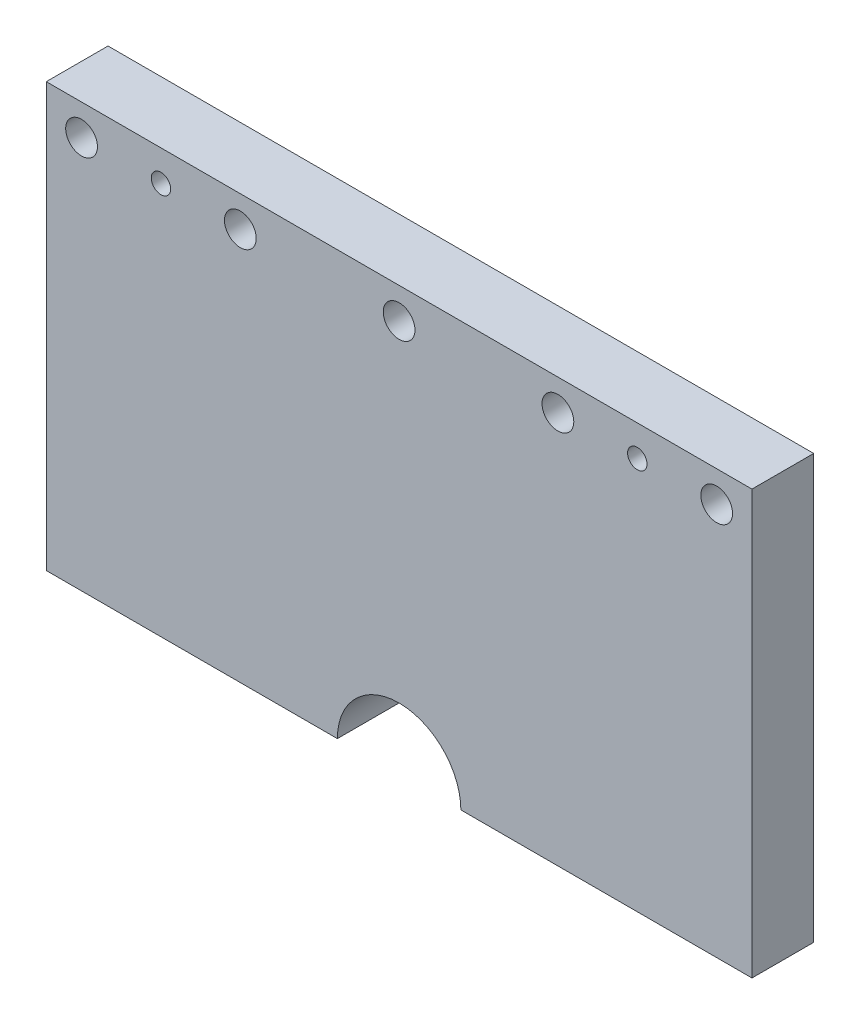
ISO-10303-21;
HEADER;
FILE_DESCRIPTION(('STEP AP214'),'2;1');
FILE_NAME('part.step','',(''),(''),'','','');
FILE_SCHEMA(('AUTOMOTIVE_DESIGN { 1 0 10303 214 1 1 1 1 }'));
ENDSEC;
DATA;
#1=APPLICATION_CONTEXT('core data for automotive mechanical design processes');
#2=APPLICATION_PROTOCOL_DEFINITION('international standard','automotive_design',2000,#1);
#3=PRODUCT_CONTEXT('',#1,'mechanical');
#4=PRODUCT('Part','Part','',(#3));
#5=PRODUCT_RELATED_PRODUCT_CATEGORY('part','',(#4));
#6=PRODUCT_DEFINITION_FORMATION('','',#4);
#7=PRODUCT_DEFINITION_CONTEXT('part definition',#1,'design');
#8=PRODUCT_DEFINITION('design','',#6,#7);
#9=PRODUCT_DEFINITION_SHAPE('','',#8);
#10=(LENGTH_UNIT() NAMED_UNIT(*) SI_UNIT(.MILLI.,.METRE.));
#11=(NAMED_UNIT(*) PLANE_ANGLE_UNIT() SI_UNIT($,.RADIAN.));
#12=(NAMED_UNIT(*) SI_UNIT($,.STERADIAN.) SOLID_ANGLE_UNIT());
#13=UNCERTAINTY_MEASURE_WITH_UNIT(LENGTH_MEASURE(1.E-05),#10,'distance_accuracy_value','');
#14=(GEOMETRIC_REPRESENTATION_CONTEXT(3) GLOBAL_UNCERTAINTY_ASSIGNED_CONTEXT((#13)) GLOBAL_UNIT_ASSIGNED_CONTEXT((#10,
#11,#12)) REPRESENTATION_CONTEXT('',''));
#15=CARTESIAN_POINT('',(0.,0.,0.));
#16=DIRECTION('',(0.,0.,1.));
#17=DIRECTION('',(1.,0.,0.));
#18=AXIS2_PLACEMENT_3D('',#15,#16,#17);
#19=CARTESIAN_POINT('',(200.,-240.,35.));
#20=DIRECTION('',(0.,1.,0.));
#21=DIRECTION('',(-1.,0.,0.));
#22=AXIS2_PLACEMENT_3D('',#19,#20,#21);
#23=PLANE('',#22);
#24=CARTESIAN_POINT('',(130.,-240.,17.5));
#25=DIRECTION('',(0.,-1.,0.));
#26=DIRECTION('',(0.,0.,-1.));
#27=AXIS2_PLACEMENT_3D('',#24,#25,#26);
#28=CIRCLE('',#27,5.);
#29=CARTESIAN_POINT('',(130.,-240.,12.5));
#30=VERTEX_POINT('',#29);
#31=EDGE_CURVE('E126',#30,#30,#28,.T.);
#32=ORIENTED_EDGE('',*,*,#31,.F.);
#33=EDGE_LOOP('',(#32));
#34=FACE_BOUND('',#33,.T.);
#35=CARTESIAN_POINT('',(180.,-240.,17.5));
#36=DIRECTION('',(0.,-1.,0.));
#37=DIRECTION('',(0.,0.,-1.));
#38=AXIS2_PLACEMENT_3D('',#35,#36,#37);
#39=CIRCLE('',#38,4.25);
#40=CARTESIAN_POINT('',(180.,-240.,13.25));
#41=VERTEX_POINT('',#40);
#42=EDGE_CURVE('E138',#41,#41,#39,.T.);
#43=ORIENTED_EDGE('',*,*,#42,.F.);
#44=EDGE_LOOP('',(#43));
#45=FACE_BOUND('',#44,.T.);
#46=CARTESIAN_POINT('',(80.0000000000002,-240.,17.5));
#47=DIRECTION('',(0.,-1.,0.));
#48=DIRECTION('',(0.,0.,-1.));
#49=AXIS2_PLACEMENT_3D('',#46,#47,#48);
#50=CIRCLE('',#49,4.25);
#51=CARTESIAN_POINT('',(80.0000000000002,-240.,13.25));
#52=VERTEX_POINT('',#51);
#53=EDGE_CURVE('E144',#52,#52,#50,.T.);
#54=ORIENTED_EDGE('',*,*,#53,.F.);
#55=EDGE_LOOP('',(#54));
#56=FACE_BOUND('',#55,.T.);
#57=DIRECTION('',(1.,0.,0.));
#58=VECTOR('',#57,1.);
#59=CARTESIAN_POINT('',(200.,-240.,35.));
#60=LINE('',#59,#58);
#61=CARTESIAN_POINT('',(35.0000000000001,-240.,35.));
#62=VERTEX_POINT('',#61);
#63=CARTESIAN_POINT('',(200.,-240.,35.));
#64=VERTEX_POINT('',#63);
#65=EDGE_CURVE('E60',#62,#64,#60,.T.);
#66=ORIENTED_EDGE('',*,*,#65,.F.);
#67=DIRECTION('',(0.,0.,-1.));
#68=VECTOR('',#67,1.);
#69=CARTESIAN_POINT('',(35.0000000000001,-240.,35.));
#70=LINE('',#69,#68);
#71=CARTESIAN_POINT('',(35.0000000000001,-240.,0.));
#72=VERTEX_POINT('',#71);
#73=EDGE_CURVE('E167',#62,#72,#70,.T.);
#74=ORIENTED_EDGE('',*,*,#73,.T.);
#75=DIRECTION('',(1.,0.,0.));
#76=VECTOR('',#75,1.);
#77=CARTESIAN_POINT('',(200.,-240.,0.));
#78=LINE('',#77,#76);
#79=CARTESIAN_POINT('',(200.,-240.,0.));
#80=VERTEX_POINT('',#79);
#81=EDGE_CURVE('E82',#72,#80,#78,.T.);
#82=ORIENTED_EDGE('',*,*,#81,.T.);
#83=DIRECTION('',(0.,0.,-1.));
#84=VECTOR('',#83,1.);
#85=CARTESIAN_POINT('',(200.,-240.,35.));
#86=LINE('',#85,#84);
#87=EDGE_CURVE('E179',#64,#80,#86,.T.);
#88=ORIENTED_EDGE('',*,*,#87,.F.);
#89=EDGE_LOOP('',(#66,#74,#82,#88));
#90=FACE_BOUND('',#89,.T.);
#91=ADVANCED_FACE('F34',(#34,#45,#56,#90),#23,.F.);
#92=CARTESIAN_POINT('',(200.,0.,35.));
#93=DIRECTION('',(-1.,0.,0.));
#94=DIRECTION('',(0.,-1.,0.));
#95=AXIS2_PLACEMENT_3D('',#92,#93,#94);
#96=PLANE('',#95);
#97=DIRECTION('',(0.,1.,0.));
#98=VECTOR('',#97,1.);
#99=CARTESIAN_POINT('',(200.,0.,0.));
#100=LINE('',#99,#98);
#101=CARTESIAN_POINT('',(200.,0.,0.));
#102=VERTEX_POINT('',#101);
#103=EDGE_CURVE('E169',#80,#102,#100,.T.);
#104=ORIENTED_EDGE('',*,*,#103,.T.);
#105=DIRECTION('',(0.,0.,-1.));
#106=VECTOR('',#105,1.);
#107=CARTESIAN_POINT('',(200.,0.,35.));
#108=LINE('',#107,#106);
#109=CARTESIAN_POINT('',(200.,0.,35.));
#110=VERTEX_POINT('',#109);
#111=EDGE_CURVE('E11',#110,#102,#108,.T.);
#112=ORIENTED_EDGE('',*,*,#111,.F.);
#113=DIRECTION('',(0.,1.,0.));
#114=VECTOR('',#113,1.);
#115=CARTESIAN_POINT('',(200.,0.,35.));
#116=LINE('',#115,#114);
#117=EDGE_CURVE('E170',#64,#110,#116,.T.);
#118=ORIENTED_EDGE('',*,*,#117,.F.);
#119=ORIENTED_EDGE('',*,*,#87,.T.);
#120=EDGE_LOOP('',(#104,#112,#118,#119));
#121=FACE_BOUND('',#120,.T.);
#122=ADVANCED_FACE('F36',(#121),#96,.F.);
#123=CARTESIAN_POINT('',(200.,0.,35.));
#124=DIRECTION('',(0.,-1.,0.));
#125=DIRECTION('',(1.,0.,0.));
#126=AXIS2_PLACEMENT_3D('',#123,#124,#125);
#127=PLANE('',#126);
#128=DIRECTION('',(-1.,0.,0.));
#129=VECTOR('',#128,1.);
#130=CARTESIAN_POINT('',(200.,0.,0.));
#131=LINE('',#130,#129);
#132=CARTESIAN_POINT('',(-200.,0.,0.));
#133=VERTEX_POINT('',#132);
#134=EDGE_CURVE('E182',#102,#133,#131,.T.);
#135=ORIENTED_EDGE('',*,*,#134,.T.);
#136=DIRECTION('',(0.,0.,-1.));
#137=VECTOR('',#136,1.);
#138=CARTESIAN_POINT('',(-200.,0.,35.));
#139=LINE('',#138,#137);
#140=CARTESIAN_POINT('',(-200.,0.,35.));
#141=VERTEX_POINT('',#140);
#142=EDGE_CURVE('E43',#141,#133,#139,.T.);
#143=ORIENTED_EDGE('',*,*,#142,.F.);
#144=DIRECTION('',(-1.,0.,0.));
#145=VECTOR('',#144,1.);
#146=CARTESIAN_POINT('',(200.,0.,35.));
#147=LINE('',#146,#145);
#148=EDGE_CURVE('E89',#110,#141,#147,.T.);
#149=ORIENTED_EDGE('',*,*,#148,.F.);
#150=ORIENTED_EDGE('',*,*,#111,.T.);
#151=EDGE_LOOP('',(#135,#143,#149,#150));
#152=FACE_BOUND('',#151,.T.);
#153=ADVANCED_FACE('F310',(#152),#127,.F.);
#154=CARTESIAN_POINT('',(-200.,0.,35.));
#155=DIRECTION('',(1.,0.,0.));
#156=DIRECTION('',(0.,1.,0.));
#157=AXIS2_PLACEMENT_3D('',#154,#155,#156);
#158=PLANE('',#157);
#159=DIRECTION('',(0.,-1.,0.));
#160=VECTOR('',#159,1.);
#161=CARTESIAN_POINT('',(-200.,0.,0.));
#162=LINE('',#161,#160);
#163=CARTESIAN_POINT('',(-200.,-240.,0.));
#164=VERTEX_POINT('',#163);
#165=EDGE_CURVE('E184',#133,#164,#162,.T.);
#166=ORIENTED_EDGE('',*,*,#165,.T.);
#167=DIRECTION('',(0.,0.,-1.));
#168=VECTOR('',#167,1.);
#169=CARTESIAN_POINT('',(-200.,-240.,35.));
#170=LINE('',#169,#168);
#171=CARTESIAN_POINT('',(-200.,-240.,35.));
#172=VERTEX_POINT('',#171);
#173=EDGE_CURVE('E189',#172,#164,#170,.T.);
#174=ORIENTED_EDGE('',*,*,#173,.F.);
#175=DIRECTION('',(0.,-1.,0.));
#176=VECTOR('',#175,1.);
#177=CARTESIAN_POINT('',(-200.,0.,35.));
#178=LINE('',#177,#176);
#179=EDGE_CURVE('E174',#141,#172,#178,.T.);
#180=ORIENTED_EDGE('',*,*,#179,.F.);
#181=ORIENTED_EDGE('',*,*,#142,.T.);
#182=EDGE_LOOP('',(#166,#174,#180,#181));
#183=FACE_BOUND('',#182,.T.);
#184=ADVANCED_FACE('F312',(#183),#158,.F.);
#185=CARTESIAN_POINT('',(-130.,-240.,17.5));
#186=DIRECTION('',(0.,-1.,0.));
#187=DIRECTION('',(0.,0.,-1.));
#188=AXIS2_PLACEMENT_3D('',#185,#186,#187);
#189=CIRCLE('',#188,5.);
#190=CARTESIAN_POINT('',(-130.,-240.,12.5));
#191=VERTEX_POINT('',#190);
#192=EDGE_CURVE('E125',#191,#191,#189,.T.);
#193=ORIENTED_EDGE('',*,*,#192,.F.);
#194=EDGE_LOOP('',(#193));
#195=FACE_BOUND('',#194,.T.);
#196=CARTESIAN_POINT('',(-79.9999999999998,-240.,17.5));
#197=DIRECTION('',(0.,-1.,0.));
#198=DIRECTION('',(0.,0.,-1.));
#199=AXIS2_PLACEMENT_3D('',#196,#197,#198);
#200=CIRCLE('',#199,4.25);
#201=CARTESIAN_POINT('',(-79.9999999999998,-240.,13.25));
#202=VERTEX_POINT('',#201);
#203=EDGE_CURVE('E150',#202,#202,#200,.T.);
#204=ORIENTED_EDGE('',*,*,#203,.F.);
#205=EDGE_LOOP('',(#204));
#206=FACE_BOUND('',#205,.T.);
#207=CARTESIAN_POINT('',(-180.,-240.,17.5));
#208=DIRECTION('',(0.,-1.,0.));
#209=DIRECTION('',(0.,0.,-1.));
#210=AXIS2_PLACEMENT_3D('',#207,#208,#209);
#211=CIRCLE('',#210,4.25);
#212=CARTESIAN_POINT('',(-180.,-240.,13.25));
#213=VERTEX_POINT('',#212);
#214=EDGE_CURVE('E156',#213,#213,#211,.T.);
#215=ORIENTED_EDGE('',*,*,#214,.F.);
#216=EDGE_LOOP('',(#215));
#217=FACE_BOUND('',#216,.T.);
#218=CARTESIAN_POINT('',(-35.,-240.,0.));
#219=VERTEX_POINT('',#218);
#220=EDGE_CURVE('E172',#164,#219,#78,.T.);
#221=ORIENTED_EDGE('',*,*,#220,.T.);
#222=DIRECTION('',(0.,0.,-1.));
#223=VECTOR('',#222,1.);
#224=CARTESIAN_POINT('',(-35.,-240.,35.));
#225=LINE('',#224,#223);
#226=CARTESIAN_POINT('',(-35.,-240.,35.));
#227=VERTEX_POINT('',#226);
#228=EDGE_CURVE('E51',#219,#227,#225,.F.);
#229=ORIENTED_EDGE('',*,*,#228,.T.);
#230=EDGE_CURVE('E176',#172,#227,#60,.T.);
#231=ORIENTED_EDGE('',*,*,#230,.F.);
#232=ORIENTED_EDGE('',*,*,#173,.T.);
#233=EDGE_LOOP('',(#221,#229,#231,#232));
#234=FACE_BOUND('',#233,.T.);
#235=ADVANCED_FACE('F296',(#195,#206,#217,#234),#23,.F.);
#236=CARTESIAN_POINT('',(0.,0.,35.));
#237=DIRECTION('',(0.,0.,-1.));
#238=DIRECTION('',(-1.,0.,0.));
#239=AXIS2_PLACEMENT_3D('',#236,#237,#238);
#240=PLANE('',#239);
#241=CARTESIAN_POINT('',(135.,-17.5,35.));
#242=DIRECTION('',(0.,0.,1.));
#243=DIRECTION('',(1.,0.,0.));
#244=AXIS2_PLACEMENT_3D('',#241,#242,#243);
#245=CIRCLE('',#244,5.49999999999998);
#246=CARTESIAN_POINT('',(140.5,-17.5,35.));
#247=VERTEX_POINT('',#246);
#248=EDGE_CURVE('E452',#247,#247,#245,.T.);
#249=ORIENTED_EDGE('',*,*,#248,.F.);
#250=EDGE_LOOP('',(#249));
#251=FACE_BOUND('',#250,.T.);
#252=CARTESIAN_POINT('',(-135.,-17.5,35.));
#253=DIRECTION('',(0.,0.,1.));
#254=DIRECTION('',(1.,0.,0.));
#255=AXIS2_PLACEMENT_3D('',#252,#253,#254);
#256=CIRCLE('',#255,5.49999999999998);
#257=CARTESIAN_POINT('',(-129.5,-17.5,35.));
#258=VERTEX_POINT('',#257);
#259=EDGE_CURVE('E203',#258,#258,#256,.T.);
#260=ORIENTED_EDGE('',*,*,#259,.F.);
#261=EDGE_LOOP('',(#260));
#262=FACE_BOUND('',#261,.T.);
#263=CARTESIAN_POINT('',(180.,-17.5,35.));
#264=DIRECTION('',(0.,0.,1.));
#265=DIRECTION('',(1.,0.,0.));
#266=AXIS2_PLACEMENT_3D('',#263,#264,#265);
#267=CIRCLE('',#266,9.00000000000001);
#268=CARTESIAN_POINT('',(189.,-17.5,35.));
#269=VERTEX_POINT('',#268);
#270=EDGE_CURVE('E213',#269,#269,#267,.T.);
#271=ORIENTED_EDGE('',*,*,#270,.F.);
#272=EDGE_LOOP('',(#271));
#273=FACE_BOUND('',#272,.T.);
#274=CARTESIAN_POINT('',(90.0000000000001,-17.5,35.));
#275=DIRECTION('',(0.,0.,1.));
#276=DIRECTION('',(1.,0.,0.));
#277=AXIS2_PLACEMENT_3D('',#274,#275,#276);
#278=CIRCLE('',#277,8.99999999999999);
#279=CARTESIAN_POINT('',(99.0000000000001,-17.5,35.));
#280=VERTEX_POINT('',#279);
#281=EDGE_CURVE('E225',#280,#280,#278,.T.);
#282=ORIENTED_EDGE('',*,*,#281,.F.);
#283=EDGE_LOOP('',(#282));
#284=FACE_BOUND('',#283,.T.);
#285=CARTESIAN_POINT('',(0.,-17.5,35.));
#286=DIRECTION('',(0.,0.,1.));
#287=DIRECTION('',(1.,0.,0.));
#288=AXIS2_PLACEMENT_3D('',#285,#286,#287);
#289=CIRCLE('',#288,9.);
#290=CARTESIAN_POINT('',(9.00000000000002,-17.5,35.));
#291=VERTEX_POINT('',#290);
#292=EDGE_CURVE('E237',#291,#291,#289,.T.);
#293=ORIENTED_EDGE('',*,*,#292,.F.);
#294=EDGE_LOOP('',(#293));
#295=FACE_BOUND('',#294,.T.);
#296=CARTESIAN_POINT('',(-90.,-17.5,35.));
#297=DIRECTION('',(0.,0.,1.));
#298=DIRECTION('',(1.,0.,0.));
#299=AXIS2_PLACEMENT_3D('',#296,#297,#298);
#300=CIRCLE('',#299,8.99999999999999);
#301=CARTESIAN_POINT('',(-81.,-17.5,35.));
#302=VERTEX_POINT('',#301);
#303=EDGE_CURVE('E249',#302,#302,#300,.T.);
#304=ORIENTED_EDGE('',*,*,#303,.F.);
#305=EDGE_LOOP('',(#304));
#306=FACE_BOUND('',#305,.T.);
#307=CARTESIAN_POINT('',(-180.,-17.5,35.));
#308=DIRECTION('',(0.,0.,1.));
#309=DIRECTION('',(1.,0.,0.));
#310=AXIS2_PLACEMENT_3D('',#307,#308,#309);
#311=CIRCLE('',#310,9.00000000000001);
#312=CARTESIAN_POINT('',(-171.,-17.5,35.));
#313=VERTEX_POINT('',#312);
#314=EDGE_CURVE('E261',#313,#313,#311,.T.);
#315=ORIENTED_EDGE('',*,*,#314,.F.);
#316=EDGE_LOOP('',(#315));
#317=FACE_BOUND('',#316,.T.);
#318=ORIENTED_EDGE('',*,*,#230,.T.);
#319=CARTESIAN_POINT('',(0.,-240.,35.));
#320=DIRECTION('',(0.,0.,-1.));
#321=DIRECTION('',(-1.,0.,0.));
#322=AXIS2_PLACEMENT_3D('',#319,#320,#321);
#323=CIRCLE('',#322,35.);
#324=EDGE_CURVE('E163',#227,#62,#323,.T.);
#325=ORIENTED_EDGE('',*,*,#324,.T.);
#326=ORIENTED_EDGE('',*,*,#65,.T.);
#327=ORIENTED_EDGE('',*,*,#117,.T.);
#328=ORIENTED_EDGE('',*,*,#148,.T.);
#329=ORIENTED_EDGE('',*,*,#179,.T.);
#330=EDGE_LOOP('',(#318,#325,#326,#327,#328,#329));
#331=FACE_BOUND('',#330,.T.);
#332=ADVANCED_FACE('F294',(#251,#262,#273,#284,#295,#306,#317,#331),#240,.F.);
#333=CARTESIAN_POINT('',(0.,0.,0.));
#334=DIRECTION('',(0.,0.,-1.));
#335=DIRECTION('',(-1.,0.,0.));
#336=AXIS2_PLACEMENT_3D('',#333,#334,#335);
#337=PLANE('',#336);
#338=CARTESIAN_POINT('',(135.,-17.5,0.));
#339=DIRECTION('',(0.,0.,1.));
#340=DIRECTION('',(1.,0.,0.));
#341=AXIS2_PLACEMENT_3D('',#338,#339,#340);
#342=CIRCLE('',#341,5.);
#343=CARTESIAN_POINT('',(140.,-17.5,0.));
#344=VERTEX_POINT('',#343);
#345=EDGE_CURVE('E195',#344,#344,#342,.T.);
#346=ORIENTED_EDGE('',*,*,#345,.T.);
#347=EDGE_LOOP('',(#346));
#348=FACE_BOUND('',#347,.T.);
#349=CARTESIAN_POINT('',(-135.,-17.5,0.));
#350=DIRECTION('',(0.,0.,1.));
#351=DIRECTION('',(1.,0.,0.));
#352=AXIS2_PLACEMENT_3D('',#349,#350,#351);
#353=CIRCLE('',#352,5.);
#354=CARTESIAN_POINT('',(-130.,-17.5,0.));
#355=VERTEX_POINT('',#354);
#356=EDGE_CURVE('E200',#355,#355,#353,.T.);
#357=ORIENTED_EDGE('',*,*,#356,.T.);
#358=EDGE_LOOP('',(#357));
#359=FACE_BOUND('',#358,.T.);
#360=CARTESIAN_POINT('',(180.,-17.5,0.));
#361=DIRECTION('',(0.,0.,1.));
#362=DIRECTION('',(1.,0.,0.));
#363=AXIS2_PLACEMENT_3D('',#360,#361,#362);
#364=CIRCLE('',#363,5.49999999999998);
#365=CARTESIAN_POINT('',(185.5,-17.5,0.));
#366=VERTEX_POINT('',#365);
#367=EDGE_CURVE('E222',#366,#366,#364,.T.);
#368=ORIENTED_EDGE('',*,*,#367,.T.);
#369=EDGE_LOOP('',(#368));
#370=FACE_BOUND('',#369,.T.);
#371=CARTESIAN_POINT('',(90.0000000000001,-17.5,0.));
#372=DIRECTION('',(0.,0.,1.));
#373=DIRECTION('',(1.,0.,0.));
#374=AXIS2_PLACEMENT_3D('',#371,#372,#373);
#375=CIRCLE('',#374,5.49999999999999);
#376=CARTESIAN_POINT('',(95.5000000000001,-17.5,0.));
#377=VERTEX_POINT('',#376);
#378=EDGE_CURVE('E234',#377,#377,#375,.T.);
#379=ORIENTED_EDGE('',*,*,#378,.T.);
#380=EDGE_LOOP('',(#379));
#381=FACE_BOUND('',#380,.T.);
#382=CARTESIAN_POINT('',(0.,-17.5,0.));
#383=DIRECTION('',(0.,0.,1.));
#384=DIRECTION('',(1.,0.,0.));
#385=AXIS2_PLACEMENT_3D('',#382,#383,#384);
#386=CIRCLE('',#385,5.49999999999999);
#387=CARTESIAN_POINT('',(5.50000000000001,-17.5,0.));
#388=VERTEX_POINT('',#387);
#389=EDGE_CURVE('E246',#388,#388,#386,.T.);
#390=ORIENTED_EDGE('',*,*,#389,.T.);
#391=EDGE_LOOP('',(#390));
#392=FACE_BOUND('',#391,.T.);
#393=CARTESIAN_POINT('',(-90.,-17.5,0.));
#394=DIRECTION('',(0.,0.,1.));
#395=DIRECTION('',(1.,0.,0.));
#396=AXIS2_PLACEMENT_3D('',#393,#394,#395);
#397=CIRCLE('',#396,5.49999999999999);
#398=CARTESIAN_POINT('',(-84.5,-17.5,0.));
#399=VERTEX_POINT('',#398);
#400=EDGE_CURVE('E258',#399,#399,#397,.T.);
#401=ORIENTED_EDGE('',*,*,#400,.T.);
#402=EDGE_LOOP('',(#401));
#403=FACE_BOUND('',#402,.T.);
#404=CARTESIAN_POINT('',(-180.,-17.5,0.));
#405=DIRECTION('',(0.,0.,1.));
#406=DIRECTION('',(1.,0.,0.));
#407=AXIS2_PLACEMENT_3D('',#404,#405,#406);
#408=CIRCLE('',#407,5.49999999999998);
#409=CARTESIAN_POINT('',(-174.5,-17.5,0.));
#410=VERTEX_POINT('',#409);
#411=EDGE_CURVE('E132',#410,#410,#408,.T.);
#412=ORIENTED_EDGE('',*,*,#411,.T.);
#413=EDGE_LOOP('',(#412));
#414=FACE_BOUND('',#413,.T.);
#415=CARTESIAN_POINT('',(0.,-240.,0.));
#416=DIRECTION('',(0.,0.,-1.));
#417=DIRECTION('',(-1.,0.,0.));
#418=AXIS2_PLACEMENT_3D('',#415,#416,#417);
#419=CIRCLE('',#418,35.);
#420=EDGE_CURVE('E162',#219,#72,#419,.T.);
#421=ORIENTED_EDGE('',*,*,#420,.F.);
#422=ORIENTED_EDGE('',*,*,#220,.F.);
#423=ORIENTED_EDGE('',*,*,#165,.F.);
#424=ORIENTED_EDGE('',*,*,#134,.F.);
#425=ORIENTED_EDGE('',*,*,#103,.F.);
#426=ORIENTED_EDGE('',*,*,#81,.F.);
#427=EDGE_LOOP('',(#421,#422,#423,#424,#425,#426));
#428=FACE_BOUND('',#427,.T.);
#429=ADVANCED_FACE('F272',(#348,#359,#370,#381,#392,#403,#414,#428),#337,.T.);
#430=CARTESIAN_POINT('',(0.,-240.,35.));
#431=DIRECTION('',(0.,0.,-1.));
#432=DIRECTION('',(-1.,0.,0.));
#433=AXIS2_PLACEMENT_3D('',#430,#431,#432);
#434=CYLINDRICAL_SURFACE('',#433,35.);
#435=ORIENTED_EDGE('',*,*,#324,.F.);
#436=ORIENTED_EDGE('',*,*,#228,.F.);
#437=ORIENTED_EDGE('',*,*,#420,.T.);
#438=ORIENTED_EDGE('',*,*,#73,.F.);
#439=EDGE_LOOP('',(#435,#436,#437,#438));
#440=FACE_BOUND('',#439,.T.);
#441=ADVANCED_FACE('F306',(#440),#434,.F.);
#442=CARTESIAN_POINT('',(-180.,-212.5,17.5));
#443=DIRECTION('',(0.,-1.,0.));
#444=DIRECTION('',(0.,0.,-1.));
#445=AXIS2_PLACEMENT_3D('',#442,#443,#444);
#446=CONICAL_SURFACE('',#445,4.25,1.02974425867665);
#447=CARTESIAN_POINT('',(-180.,-209.946342369133,17.5));
#448=VERTEX_POINT('',#447);
#449=VERTEX_LOOP('',#448);
#450=FACE_BOUND('',#449,.T.);
#451=CARTESIAN_POINT('',(-180.,-212.5,17.5));
#452=DIRECTION('',(0.,-1.,0.));
#453=DIRECTION('',(0.,0.,-1.));
#454=AXIS2_PLACEMENT_3D('',#451,#452,#453);
#455=CIRCLE('',#454,4.25);
#456=CARTESIAN_POINT('',(-180.,-212.5,13.25));
#457=VERTEX_POINT('',#456);
#458=EDGE_CURVE('E159',#457,#457,#455,.T.);
#459=ORIENTED_EDGE('',*,*,#458,.T.);
#460=EDGE_LOOP('',(#459));
#461=FACE_BOUND('',#460,.T.);
#462=ADVANCED_FACE('F335',(#450,#461),#446,.F.);
#463=CARTESIAN_POINT('',(-180.,-240.,17.5));
#464=DIRECTION('',(0.,-1.,0.));
#465=DIRECTION('',(0.,0.,-1.));
#466=AXIS2_PLACEMENT_3D('',#463,#464,#465);
#467=CYLINDRICAL_SURFACE('',#466,4.25);
#468=ORIENTED_EDGE('',*,*,#458,.F.);
#469=EDGE_LOOP('',(#468));
#470=FACE_BOUND('',#469,.T.);
#471=ORIENTED_EDGE('',*,*,#214,.T.);
#472=EDGE_LOOP('',(#471));
#473=FACE_BOUND('',#472,.T.);
#474=ADVANCED_FACE('F338',(#470,#473),#467,.F.);
#475=CARTESIAN_POINT('',(-79.9999999999998,-212.5,17.5));
#476=DIRECTION('',(0.,-1.,0.));
#477=DIRECTION('',(0.,0.,-1.));
#478=AXIS2_PLACEMENT_3D('',#475,#476,#477);
#479=CONICAL_SURFACE('',#478,4.25,1.02974425867665);
#480=CARTESIAN_POINT('',(-79.9999999999998,-209.946342369133,17.5));
#481=VERTEX_POINT('',#480);
#482=VERTEX_LOOP('',#481);
#483=FACE_BOUND('',#482,.T.);
#484=CARTESIAN_POINT('',(-79.9999999999998,-212.5,17.5));
#485=DIRECTION('',(0.,-1.,0.));
#486=DIRECTION('',(0.,0.,-1.));
#487=AXIS2_PLACEMENT_3D('',#484,#485,#486);
#488=CIRCLE('',#487,4.25);
#489=CARTESIAN_POINT('',(-79.9999999999998,-212.5,13.25));
#490=VERTEX_POINT('',#489);
#491=EDGE_CURVE('E153',#490,#490,#488,.T.);
#492=ORIENTED_EDGE('',*,*,#491,.T.);
#493=EDGE_LOOP('',(#492));
#494=FACE_BOUND('',#493,.T.);
#495=ADVANCED_FACE('F342',(#483,#494),#479,.F.);
#496=CARTESIAN_POINT('',(-79.9999999999998,-240.,17.5));
#497=DIRECTION('',(0.,-1.,0.));
#498=DIRECTION('',(0.,0.,-1.));
#499=AXIS2_PLACEMENT_3D('',#496,#497,#498);
#500=CYLINDRICAL_SURFACE('',#499,4.25);
#501=ORIENTED_EDGE('',*,*,#491,.F.);
#502=EDGE_LOOP('',(#501));
#503=FACE_BOUND('',#502,.T.);
#504=ORIENTED_EDGE('',*,*,#203,.T.);
#505=EDGE_LOOP('',(#504));
#506=FACE_BOUND('',#505,.T.);
#507=ADVANCED_FACE('F346',(#503,#506),#500,.F.);
#508=CARTESIAN_POINT('',(80.0000000000002,-212.5,17.5));
#509=DIRECTION('',(0.,-1.,0.));
#510=DIRECTION('',(0.,0.,-1.));
#511=AXIS2_PLACEMENT_3D('',#508,#509,#510);
#512=CONICAL_SURFACE('',#511,4.25,1.02974425867665);
#513=CARTESIAN_POINT('',(80.0000000000002,-209.946342369133,17.5));
#514=VERTEX_POINT('',#513);
#515=VERTEX_LOOP('',#514);
#516=FACE_BOUND('',#515,.T.);
#517=CARTESIAN_POINT('',(80.0000000000002,-212.5,17.5));
#518=DIRECTION('',(0.,-1.,0.));
#519=DIRECTION('',(0.,0.,-1.));
#520=AXIS2_PLACEMENT_3D('',#517,#518,#519);
#521=CIRCLE('',#520,4.25);
#522=CARTESIAN_POINT('',(80.0000000000002,-212.5,13.25));
#523=VERTEX_POINT('',#522);
#524=EDGE_CURVE('E147',#523,#523,#521,.T.);
#525=ORIENTED_EDGE('',*,*,#524,.T.);
#526=EDGE_LOOP('',(#525));
#527=FACE_BOUND('',#526,.T.);
#528=ADVANCED_FACE('F350',(#516,#527),#512,.F.);
#529=CARTESIAN_POINT('',(80.0000000000002,-240.,17.5));
#530=DIRECTION('',(0.,-1.,0.));
#531=DIRECTION('',(0.,0.,-1.));
#532=AXIS2_PLACEMENT_3D('',#529,#530,#531);
#533=CYLINDRICAL_SURFACE('',#532,4.25);
#534=ORIENTED_EDGE('',*,*,#524,.F.);
#535=EDGE_LOOP('',(#534));
#536=FACE_BOUND('',#535,.T.);
#537=ORIENTED_EDGE('',*,*,#53,.T.);
#538=EDGE_LOOP('',(#537));
#539=FACE_BOUND('',#538,.T.);
#540=ADVANCED_FACE('F354',(#536,#539),#533,.F.);
#541=CARTESIAN_POINT('',(180.,-212.5,17.5));
#542=DIRECTION('',(0.,-1.,0.));
#543=DIRECTION('',(0.,0.,-1.));
#544=AXIS2_PLACEMENT_3D('',#541,#542,#543);
#545=CONICAL_SURFACE('',#544,4.25,1.02974425867665);
#546=CARTESIAN_POINT('',(180.,-209.946342369133,17.5));
#547=VERTEX_POINT('',#546);
#548=VERTEX_LOOP('',#547);
#549=FACE_BOUND('',#548,.T.);
#550=CARTESIAN_POINT('',(180.,-212.5,17.5));
#551=DIRECTION('',(0.,-1.,0.));
#552=DIRECTION('',(0.,0.,-1.));
#553=AXIS2_PLACEMENT_3D('',#550,#551,#552);
#554=CIRCLE('',#553,4.25);
#555=CARTESIAN_POINT('',(180.,-212.5,13.25));
#556=VERTEX_POINT('',#555);
#557=EDGE_CURVE('E141',#556,#556,#554,.T.);
#558=ORIENTED_EDGE('',*,*,#557,.T.);
#559=EDGE_LOOP('',(#558));
#560=FACE_BOUND('',#559,.T.);
#561=ADVANCED_FACE('F358',(#549,#560),#545,.F.);
#562=CARTESIAN_POINT('',(180.,-240.,17.5));
#563=DIRECTION('',(0.,-1.,0.));
#564=DIRECTION('',(0.,0.,-1.));
#565=AXIS2_PLACEMENT_3D('',#562,#563,#564);
#566=CYLINDRICAL_SURFACE('',#565,4.25);
#567=ORIENTED_EDGE('',*,*,#557,.F.);
#568=EDGE_LOOP('',(#567));
#569=FACE_BOUND('',#568,.T.);
#570=ORIENTED_EDGE('',*,*,#42,.T.);
#571=EDGE_LOOP('',(#570));
#572=FACE_BOUND('',#571,.T.);
#573=ADVANCED_FACE('F362',(#569,#572),#566,.F.);
#574=CARTESIAN_POINT('',(-130.,-212.5,17.5));
#575=DIRECTION('',(0.,-1.,0.));
#576=DIRECTION('',(0.,0.,-1.));
#577=AXIS2_PLACEMENT_3D('',#574,#575,#576);
#578=CONICAL_SURFACE('',#577,4.99999999999999,1.02974425867665);
#579=CARTESIAN_POINT('',(-130.,-209.495696904862,17.5));
#580=VERTEX_POINT('',#579);
#581=VERTEX_LOOP('',#580);
#582=FACE_BOUND('',#581,.T.);
#583=CARTESIAN_POINT('',(-130.,-212.5,17.5));
#584=DIRECTION('',(0.,-1.,0.));
#585=DIRECTION('',(0.,0.,-1.));
#586=AXIS2_PLACEMENT_3D('',#583,#584,#585);
#587=CIRCLE('',#586,4.99999999999999);
#588=CARTESIAN_POINT('',(-130.,-212.5,12.5));
#589=VERTEX_POINT('',#588);
#590=EDGE_CURVE('E129',#589,#589,#587,.T.);
#591=ORIENTED_EDGE('',*,*,#590,.T.);
#592=EDGE_LOOP('',(#591));
#593=FACE_BOUND('',#592,.T.);
#594=ADVANCED_FACE('F366',(#582,#593),#578,.F.);
#595=CARTESIAN_POINT('',(-130.,-240.,17.5));
#596=DIRECTION('',(0.,-1.,0.));
#597=DIRECTION('',(0.,0.,-1.));
#598=AXIS2_PLACEMENT_3D('',#595,#596,#597);
#599=CYLINDRICAL_SURFACE('',#598,5.);
#600=ORIENTED_EDGE('',*,*,#590,.F.);
#601=EDGE_LOOP('',(#600));
#602=FACE_BOUND('',#601,.T.);
#603=ORIENTED_EDGE('',*,*,#192,.T.);
#604=EDGE_LOOP('',(#603));
#605=FACE_BOUND('',#604,.T.);
#606=ADVANCED_FACE('F119',(#602,#605),#599,.F.);
#607=CARTESIAN_POINT('',(130.,-212.5,17.5));
#608=DIRECTION('',(0.,-1.,0.));
#609=DIRECTION('',(0.,0.,-1.));
#610=AXIS2_PLACEMENT_3D('',#607,#608,#609);
#611=CONICAL_SURFACE('',#610,5.,1.02974425867666);
#612=CARTESIAN_POINT('',(130.,-209.495696904862,17.5));
#613=VERTEX_POINT('',#612);
#614=VERTEX_LOOP('',#613);
#615=FACE_BOUND('',#614,.T.);
#616=CARTESIAN_POINT('',(130.,-212.5,17.5));
#617=DIRECTION('',(0.,-1.,0.));
#618=DIRECTION('',(0.,0.,-1.));
#619=AXIS2_PLACEMENT_3D('',#616,#617,#618);
#620=CIRCLE('',#619,5.);
#621=CARTESIAN_POINT('',(130.,-212.5,12.5));
#622=VERTEX_POINT('',#621);
#623=EDGE_CURVE('E123',#622,#622,#620,.T.);
#624=ORIENTED_EDGE('',*,*,#623,.T.);
#625=EDGE_LOOP('',(#624));
#626=FACE_BOUND('',#625,.T.);
#627=ADVANCED_FACE('F115',(#615,#626),#611,.F.);
#628=CARTESIAN_POINT('',(130.,-240.,17.5));
#629=DIRECTION('',(0.,-1.,0.));
#630=DIRECTION('',(0.,0.,-1.));
#631=AXIS2_PLACEMENT_3D('',#628,#629,#630);
#632=CYLINDRICAL_SURFACE('',#631,5.);
#633=ORIENTED_EDGE('',*,*,#623,.F.);
#634=EDGE_LOOP('',(#633));
#635=FACE_BOUND('',#634,.T.);
#636=ORIENTED_EDGE('',*,*,#31,.T.);
#637=EDGE_LOOP('',(#636));
#638=FACE_BOUND('',#637,.T.);
#639=ADVANCED_FACE('F118',(#635,#638),#632,.F.);
#640=CARTESIAN_POINT('',(-180.,-17.5,35.));
#641=DIRECTION('',(0.,0.,1.));
#642=DIRECTION('',(1.,0.,0.));
#643=AXIS2_PLACEMENT_3D('',#640,#641,#642);
#644=CYLINDRICAL_SURFACE('',#643,5.49999999999999);
#645=ORIENTED_EDGE('',*,*,#411,.F.);
#646=EDGE_LOOP('',(#645));
#647=FACE_BOUND('',#646,.T.);
#648=CARTESIAN_POINT('',(-180.,-17.5,20.));
#649=DIRECTION('',(0.,0.,1.));
#650=DIRECTION('',(1.,0.,0.));
#651=AXIS2_PLACEMENT_3D('',#648,#649,#650);
#652=CIRCLE('',#651,5.50000000000001);
#653=CARTESIAN_POINT('',(-174.5,-17.5,20.));
#654=VERTEX_POINT('',#653);
#655=EDGE_CURVE('E267',#654,#654,#652,.T.);
#656=ORIENTED_EDGE('',*,*,#655,.T.);
#657=EDGE_LOOP('',(#656));
#658=FACE_BOUND('',#657,.T.);
#659=ADVANCED_FACE('F275',(#647,#658),#644,.F.);
#660=CARTESIAN_POINT('',(-174.5,-17.5,20.));
#661=DIRECTION('',(0.,0.,-1.));
#662=DIRECTION('',(-1.,0.,0.));
#663=AXIS2_PLACEMENT_3D('',#660,#661,#662);
#664=PLANE('',#663);
#665=ORIENTED_EDGE('',*,*,#655,.F.);
#666=EDGE_LOOP('',(#665));
#667=FACE_BOUND('',#666,.T.);
#668=CARTESIAN_POINT('',(-180.,-17.5,20.));
#669=DIRECTION('',(0.,0.,1.));
#670=DIRECTION('',(1.,0.,0.));
#671=AXIS2_PLACEMENT_3D('',#668,#669,#670);
#672=CIRCLE('',#671,9.00000000000001);
#673=CARTESIAN_POINT('',(-171.,-17.5,20.));
#674=VERTEX_POINT('',#673);
#675=EDGE_CURVE('E264',#674,#674,#672,.T.);
#676=ORIENTED_EDGE('',*,*,#675,.T.);
#677=EDGE_LOOP('',(#676));
#678=FACE_BOUND('',#677,.T.);
#679=ADVANCED_FACE('F278',(#667,#678),#664,.F.);
#680=CARTESIAN_POINT('',(-180.,-17.5,35.));
#681=DIRECTION('',(0.,0.,1.));
#682=DIRECTION('',(1.,0.,0.));
#683=AXIS2_PLACEMENT_3D('',#680,#681,#682);
#684=CYLINDRICAL_SURFACE('',#683,9.00000000000001);
#685=ORIENTED_EDGE('',*,*,#675,.F.);
#686=EDGE_LOOP('',(#685));
#687=FACE_BOUND('',#686,.T.);
#688=ORIENTED_EDGE('',*,*,#314,.T.);
#689=EDGE_LOOP('',(#688));
#690=FACE_BOUND('',#689,.T.);
#691=ADVANCED_FACE('F284',(#687,#690),#684,.F.);
#692=CARTESIAN_POINT('',(-90.,-17.5,35.));
#693=DIRECTION('',(0.,0.,1.));
#694=DIRECTION('',(1.,0.,0.));
#695=AXIS2_PLACEMENT_3D('',#692,#693,#694);
#696=CYLINDRICAL_SURFACE('',#695,5.5);
#697=ORIENTED_EDGE('',*,*,#400,.F.);
#698=EDGE_LOOP('',(#697));
#699=FACE_BOUND('',#698,.T.);
#700=CARTESIAN_POINT('',(-90.,-17.5,20.));
#701=DIRECTION('',(0.,0.,1.));
#702=DIRECTION('',(1.,0.,0.));
#703=AXIS2_PLACEMENT_3D('',#700,#701,#702);
#704=CIRCLE('',#703,5.50000000000001);
#705=CARTESIAN_POINT('',(-84.5,-17.5,20.));
#706=VERTEX_POINT('',#705);
#707=EDGE_CURVE('E255',#706,#706,#704,.T.);
#708=ORIENTED_EDGE('',*,*,#707,.T.);
#709=EDGE_LOOP('',(#708));
#710=FACE_BOUND('',#709,.T.);
#711=ADVANCED_FACE('F290',(#699,#710),#696,.F.);
#712=CARTESIAN_POINT('',(-84.5,-17.5,20.));
#713=DIRECTION('',(0.,0.,-1.));
#714=DIRECTION('',(-1.,0.,0.));
#715=AXIS2_PLACEMENT_3D('',#712,#713,#714);
#716=PLANE('',#715);
#717=ORIENTED_EDGE('',*,*,#707,.F.);
#718=EDGE_LOOP('',(#717));
#719=FACE_BOUND('',#718,.T.);
#720=CARTESIAN_POINT('',(-90.,-17.5,20.));
#721=DIRECTION('',(0.,0.,1.));
#722=DIRECTION('',(1.,0.,0.));
#723=AXIS2_PLACEMENT_3D('',#720,#721,#722);
#724=CIRCLE('',#723,8.99999999999999);
#725=CARTESIAN_POINT('',(-81.,-17.5,20.));
#726=VERTEX_POINT('',#725);
#727=EDGE_CURVE('E252',#726,#726,#724,.T.);
#728=ORIENTED_EDGE('',*,*,#727,.T.);
#729=EDGE_LOOP('',(#728));
#730=FACE_BOUND('',#729,.T.);
#731=ADVANCED_FACE('F378',(#719,#730),#716,.F.);
#732=CARTESIAN_POINT('',(-90.,-17.5,35.));
#733=DIRECTION('',(0.,0.,1.));
#734=DIRECTION('',(1.,0.,0.));
#735=AXIS2_PLACEMENT_3D('',#732,#733,#734);
#736=CYLINDRICAL_SURFACE('',#735,8.99999999999999);
#737=ORIENTED_EDGE('',*,*,#727,.F.);
#738=EDGE_LOOP('',(#737));
#739=FACE_BOUND('',#738,.T.);
#740=ORIENTED_EDGE('',*,*,#303,.T.);
#741=EDGE_LOOP('',(#740));
#742=FACE_BOUND('',#741,.T.);
#743=ADVANCED_FACE('F382',(#739,#742),#736,.F.);
#744=CARTESIAN_POINT('',(0.,-17.5,35.));
#745=DIRECTION('',(0.,0.,1.));
#746=DIRECTION('',(1.,0.,0.));
#747=AXIS2_PLACEMENT_3D('',#744,#745,#746);
#748=CYLINDRICAL_SURFACE('',#747,5.49999999999999);
#749=ORIENTED_EDGE('',*,*,#389,.F.);
#750=EDGE_LOOP('',(#749));
#751=FACE_BOUND('',#750,.T.);
#752=CARTESIAN_POINT('',(0.,-17.5,20.));
#753=DIRECTION('',(0.,0.,1.));
#754=DIRECTION('',(1.,0.,0.));
#755=AXIS2_PLACEMENT_3D('',#752,#753,#754);
#756=CIRCLE('',#755,5.5);
#757=CARTESIAN_POINT('',(5.50000000000002,-17.5,20.));
#758=VERTEX_POINT('',#757);
#759=EDGE_CURVE('E243',#758,#758,#756,.T.);
#760=ORIENTED_EDGE('',*,*,#759,.T.);
#761=EDGE_LOOP('',(#760));
#762=FACE_BOUND('',#761,.T.);
#763=ADVANCED_FACE('F386',(#751,#762),#748,.F.);
#764=CARTESIAN_POINT('',(5.50000000000002,-17.5,20.));
#765=DIRECTION('',(0.,0.,-1.));
#766=DIRECTION('',(-1.,0.,0.));
#767=AXIS2_PLACEMENT_3D('',#764,#765,#766);
#768=PLANE('',#767);
#769=ORIENTED_EDGE('',*,*,#759,.F.);
#770=EDGE_LOOP('',(#769));
#771=FACE_BOUND('',#770,.T.);
#772=CARTESIAN_POINT('',(0.,-17.5,20.));
#773=DIRECTION('',(0.,0.,1.));
#774=DIRECTION('',(1.,0.,0.));
#775=AXIS2_PLACEMENT_3D('',#772,#773,#774);
#776=CIRCLE('',#775,9.);
#777=CARTESIAN_POINT('',(9.00000000000002,-17.5,20.));
#778=VERTEX_POINT('',#777);
#779=EDGE_CURVE('E240',#778,#778,#776,.T.);
#780=ORIENTED_EDGE('',*,*,#779,.T.);
#781=EDGE_LOOP('',(#780));
#782=FACE_BOUND('',#781,.T.);
#783=ADVANCED_FACE('F390',(#771,#782),#768,.F.);
#784=CARTESIAN_POINT('',(0.,-17.5,35.));
#785=DIRECTION('',(0.,0.,1.));
#786=DIRECTION('',(1.,0.,0.));
#787=AXIS2_PLACEMENT_3D('',#784,#785,#786);
#788=CYLINDRICAL_SURFACE('',#787,9.);
#789=ORIENTED_EDGE('',*,*,#779,.F.);
#790=EDGE_LOOP('',(#789));
#791=FACE_BOUND('',#790,.T.);
#792=ORIENTED_EDGE('',*,*,#292,.T.);
#793=EDGE_LOOP('',(#792));
#794=FACE_BOUND('',#793,.T.);
#795=ADVANCED_FACE('F394',(#791,#794),#788,.F.);
#796=CARTESIAN_POINT('',(90.0000000000001,-17.5,35.));
#797=DIRECTION('',(0.,0.,1.));
#798=DIRECTION('',(1.,0.,0.));
#799=AXIS2_PLACEMENT_3D('',#796,#797,#798);
#800=CYLINDRICAL_SURFACE('',#799,5.5);
#801=ORIENTED_EDGE('',*,*,#378,.F.);
#802=EDGE_LOOP('',(#801));
#803=FACE_BOUND('',#802,.T.);
#804=CARTESIAN_POINT('',(90.0000000000001,-17.5,20.));
#805=DIRECTION('',(0.,0.,1.));
#806=DIRECTION('',(1.,0.,0.));
#807=AXIS2_PLACEMENT_3D('',#804,#805,#806);
#808=CIRCLE('',#807,5.50000000000001);
#809=CARTESIAN_POINT('',(95.5000000000001,-17.5,20.));
#810=VERTEX_POINT('',#809);
#811=EDGE_CURVE('E231',#810,#810,#808,.T.);
#812=ORIENTED_EDGE('',*,*,#811,.T.);
#813=EDGE_LOOP('',(#812));
#814=FACE_BOUND('',#813,.T.);
#815=ADVANCED_FACE('F398',(#803,#814),#800,.F.);
#816=CARTESIAN_POINT('',(95.5000000000001,-17.5,20.));
#817=DIRECTION('',(0.,0.,-1.));
#818=DIRECTION('',(-1.,0.,0.));
#819=AXIS2_PLACEMENT_3D('',#816,#817,#818);
#820=PLANE('',#819);
#821=ORIENTED_EDGE('',*,*,#811,.F.);
#822=EDGE_LOOP('',(#821));
#823=FACE_BOUND('',#822,.T.);
#824=CARTESIAN_POINT('',(90.0000000000001,-17.5,20.));
#825=DIRECTION('',(0.,0.,1.));
#826=DIRECTION('',(1.,0.,0.));
#827=AXIS2_PLACEMENT_3D('',#824,#825,#826);
#828=CIRCLE('',#827,8.99999999999999);
#829=CARTESIAN_POINT('',(99.0000000000001,-17.5,20.));
#830=VERTEX_POINT('',#829);
#831=EDGE_CURVE('E228',#830,#830,#828,.T.);
#832=ORIENTED_EDGE('',*,*,#831,.T.);
#833=EDGE_LOOP('',(#832));
#834=FACE_BOUND('',#833,.T.);
#835=ADVANCED_FACE('F402',(#823,#834),#820,.F.);
#836=CARTESIAN_POINT('',(90.0000000000001,-17.5,35.));
#837=DIRECTION('',(0.,0.,1.));
#838=DIRECTION('',(1.,0.,0.));
#839=AXIS2_PLACEMENT_3D('',#836,#837,#838);
#840=CYLINDRICAL_SURFACE('',#839,8.99999999999999);
#841=ORIENTED_EDGE('',*,*,#831,.F.);
#842=EDGE_LOOP('',(#841));
#843=FACE_BOUND('',#842,.T.);
#844=ORIENTED_EDGE('',*,*,#281,.T.);
#845=EDGE_LOOP('',(#844));
#846=FACE_BOUND('',#845,.T.);
#847=ADVANCED_FACE('F406',(#843,#846),#840,.F.);
#848=CARTESIAN_POINT('',(180.,-17.5,35.));
#849=DIRECTION('',(0.,0.,1.));
#850=DIRECTION('',(1.,0.,0.));
#851=AXIS2_PLACEMENT_3D('',#848,#849,#850);
#852=CYLINDRICAL_SURFACE('',#851,5.49999999999999);
#853=ORIENTED_EDGE('',*,*,#367,.F.);
#854=EDGE_LOOP('',(#853));
#855=FACE_BOUND('',#854,.T.);
#856=CARTESIAN_POINT('',(180.,-17.5,20.));
#857=DIRECTION('',(0.,0.,1.));
#858=DIRECTION('',(1.,0.,0.));
#859=AXIS2_PLACEMENT_3D('',#856,#857,#858);
#860=CIRCLE('',#859,5.50000000000001);
#861=CARTESIAN_POINT('',(185.5,-17.5,20.));
#862=VERTEX_POINT('',#861);
#863=EDGE_CURVE('E219',#862,#862,#860,.T.);
#864=ORIENTED_EDGE('',*,*,#863,.T.);
#865=EDGE_LOOP('',(#864));
#866=FACE_BOUND('',#865,.T.);
#867=ADVANCED_FACE('F410',(#855,#866),#852,.F.);
#868=CARTESIAN_POINT('',(185.5,-17.5,20.));
#869=DIRECTION('',(0.,0.,-1.));
#870=DIRECTION('',(-1.,0.,0.));
#871=AXIS2_PLACEMENT_3D('',#868,#869,#870);
#872=PLANE('',#871);
#873=ORIENTED_EDGE('',*,*,#863,.F.);
#874=EDGE_LOOP('',(#873));
#875=FACE_BOUND('',#874,.T.);
#876=CARTESIAN_POINT('',(180.,-17.5,20.));
#877=DIRECTION('',(0.,0.,1.));
#878=DIRECTION('',(1.,0.,0.));
#879=AXIS2_PLACEMENT_3D('',#876,#877,#878);
#880=CIRCLE('',#879,9.00000000000001);
#881=CARTESIAN_POINT('',(189.,-17.5,20.));
#882=VERTEX_POINT('',#881);
#883=EDGE_CURVE('E216',#882,#882,#880,.T.);
#884=ORIENTED_EDGE('',*,*,#883,.T.);
#885=EDGE_LOOP('',(#884));
#886=FACE_BOUND('',#885,.T.);
#887=ADVANCED_FACE('F414',(#875,#886),#872,.F.);
#888=CARTESIAN_POINT('',(180.,-17.5,35.));
#889=DIRECTION('',(0.,0.,1.));
#890=DIRECTION('',(1.,0.,0.));
#891=AXIS2_PLACEMENT_3D('',#888,#889,#890);
#892=CYLINDRICAL_SURFACE('',#891,9.00000000000001);
#893=ORIENTED_EDGE('',*,*,#883,.F.);
#894=EDGE_LOOP('',(#893));
#895=FACE_BOUND('',#894,.T.);
#896=ORIENTED_EDGE('',*,*,#270,.T.);
#897=EDGE_LOOP('',(#896));
#898=FACE_BOUND('',#897,.T.);
#899=ADVANCED_FACE('F418',(#895,#898),#892,.F.);
#900=CARTESIAN_POINT('',(-135.,-17.5,35.));
#901=DIRECTION('',(0.,0.,1.));
#902=DIRECTION('',(1.,0.,0.));
#903=AXIS2_PLACEMENT_3D('',#900,#901,#902);
#904=CYLINDRICAL_SURFACE('',#903,5.);
#905=CARTESIAN_POINT('',(-135.,-17.5,19.6995696904862));
#906=DIRECTION('',(0.,0.,1.));
#907=DIRECTION('',(1.,0.,0.));
#908=AXIS2_PLACEMENT_3D('',#905,#906,#907);
#909=CIRCLE('',#908,5.);
#910=CARTESIAN_POINT('',(-130.,-17.5,19.6995696904862));
#911=VERTEX_POINT('',#910);
#912=EDGE_CURVE('E193',#911,#911,#909,.T.);
#913=ORIENTED_EDGE('',*,*,#912,.T.);
#914=EDGE_LOOP('',(#913));
#915=FACE_BOUND('',#914,.T.);
#916=ORIENTED_EDGE('',*,*,#356,.F.);
#917=EDGE_LOOP('',(#916));
#918=FACE_BOUND('',#917,.T.);
#919=ADVANCED_FACE('F422',(#915,#918),#904,.F.);
#920=CARTESIAN_POINT('',(135.,-17.5,35.));
#921=DIRECTION('',(0.,0.,1.));
#922=DIRECTION('',(1.,0.,0.));
#923=AXIS2_PLACEMENT_3D('',#920,#921,#922);
#924=CYLINDRICAL_SURFACE('',#923,5.);
#925=CARTESIAN_POINT('',(135.,-17.5,19.6995696904862));
#926=DIRECTION('',(0.,0.,1.));
#927=DIRECTION('',(1.,0.,0.));
#928=AXIS2_PLACEMENT_3D('',#925,#926,#927);
#929=CIRCLE('',#928,5.);
#930=CARTESIAN_POINT('',(140.,-17.5,19.6995696904862));
#931=VERTEX_POINT('',#930);
#932=EDGE_CURVE('E38',#931,#931,#929,.T.);
#933=ORIENTED_EDGE('',*,*,#932,.T.);
#934=EDGE_LOOP('',(#933));
#935=FACE_BOUND('',#934,.T.);
#936=ORIENTED_EDGE('',*,*,#345,.F.);
#937=EDGE_LOOP('',(#936));
#938=FACE_BOUND('',#937,.T.);
#939=ADVANCED_FACE('F426',(#935,#938),#924,.F.);
#940=CARTESIAN_POINT('',(-135.,-17.5,20.));
#941=DIRECTION('',(0.,0.,1.));
#942=DIRECTION('',(1.,0.,0.));
#943=AXIS2_PLACEMENT_3D('',#940,#941,#942);
#944=CONICAL_SURFACE('',#943,5.50000000000001,1.02974425867666);
#945=CARTESIAN_POINT('',(-135.,-17.5,20.));
#946=DIRECTION('',(0.,0.,1.));
#947=DIRECTION('',(1.,0.,0.));
#948=AXIS2_PLACEMENT_3D('',#945,#946,#947);
#949=CIRCLE('',#948,5.50000000000001);
#950=CARTESIAN_POINT('',(-129.5,-17.5,20.));
#951=VERTEX_POINT('',#950);
#952=EDGE_CURVE('E196',#951,#951,#949,.T.);
#953=ORIENTED_EDGE('',*,*,#952,.T.);
#954=EDGE_LOOP('',(#953));
#955=FACE_BOUND('',#954,.T.);
#956=ORIENTED_EDGE('',*,*,#912,.F.);
#957=EDGE_LOOP('',(#956));
#958=FACE_BOUND('',#957,.T.);
#959=ADVANCED_FACE('F429',(#955,#958),#944,.F.);
#960=CARTESIAN_POINT('',(-135.,-17.5,35.));
#961=DIRECTION('',(0.,0.,1.));
#962=DIRECTION('',(1.,0.,0.));
#963=AXIS2_PLACEMENT_3D('',#960,#961,#962);
#964=CYLINDRICAL_SURFACE('',#963,5.49999999999999);
#965=ORIENTED_EDGE('',*,*,#952,.F.);
#966=EDGE_LOOP('',(#965));
#967=FACE_BOUND('',#966,.T.);
#968=ORIENTED_EDGE('',*,*,#259,.T.);
#969=EDGE_LOOP('',(#968));
#970=FACE_BOUND('',#969,.T.);
#971=ADVANCED_FACE('F433',(#967,#970),#964,.F.);
#972=CARTESIAN_POINT('',(135.,-17.5,20.));
#973=DIRECTION('',(0.,0.,1.));
#974=DIRECTION('',(1.,0.,0.));
#975=AXIS2_PLACEMENT_3D('',#972,#973,#974);
#976=CONICAL_SURFACE('',#975,5.50000000000001,1.02974425867666);
#977=CARTESIAN_POINT('',(135.,-17.5,20.));
#978=DIRECTION('',(0.,0.,1.));
#979=DIRECTION('',(1.,0.,0.));
#980=AXIS2_PLACEMENT_3D('',#977,#978,#979);
#981=CIRCLE('',#980,5.50000000000001);
#982=CARTESIAN_POINT('',(140.5,-17.5,20.));
#983=VERTEX_POINT('',#982);
#984=EDGE_CURVE('E449',#983,#983,#981,.T.);
#985=ORIENTED_EDGE('',*,*,#984,.T.);
#986=EDGE_LOOP('',(#985));
#987=FACE_BOUND('',#986,.T.);
#988=ORIENTED_EDGE('',*,*,#932,.F.);
#989=EDGE_LOOP('',(#988));
#990=FACE_BOUND('',#989,.T.);
#991=ADVANCED_FACE('F436',(#987,#990),#976,.F.);
#992=CARTESIAN_POINT('',(135.,-17.5,35.));
#993=DIRECTION('',(0.,0.,1.));
#994=DIRECTION('',(1.,0.,0.));
#995=AXIS2_PLACEMENT_3D('',#992,#993,#994);
#996=CYLINDRICAL_SURFACE('',#995,5.49999999999999);
#997=ORIENTED_EDGE('',*,*,#984,.F.);
#998=EDGE_LOOP('',(#997));
#999=FACE_BOUND('',#998,.T.);
#1000=ORIENTED_EDGE('',*,*,#248,.T.);
#1001=EDGE_LOOP('',(#1000));
#1002=FACE_BOUND('',#1001,.T.);
#1003=ADVANCED_FACE('F440',(#999,#1002),#996,.F.);
#1004=CLOSED_SHELL('',(#91,#122,#153,#184,#235,#332,#429,#441,#462,#474,#495,#507,#528,#540,
#561,#573,#594,#606,#627,#639,#659,#679,#691,#711,#731,#743,#763,#783,#795,#815,#835,#847,#867,
#887,#899,#919,#939,#959,#971,#991,#1003));
#1005=MANIFOLD_SOLID_BREP('B2',#1004);
#1006=ADVANCED_BREP_SHAPE_REPRESENTATION('',(#18,#1005),#14);
#1007=SHAPE_DEFINITION_REPRESENTATION(#9,#1006);
ENDSEC;
END-ISO-10303-21;
